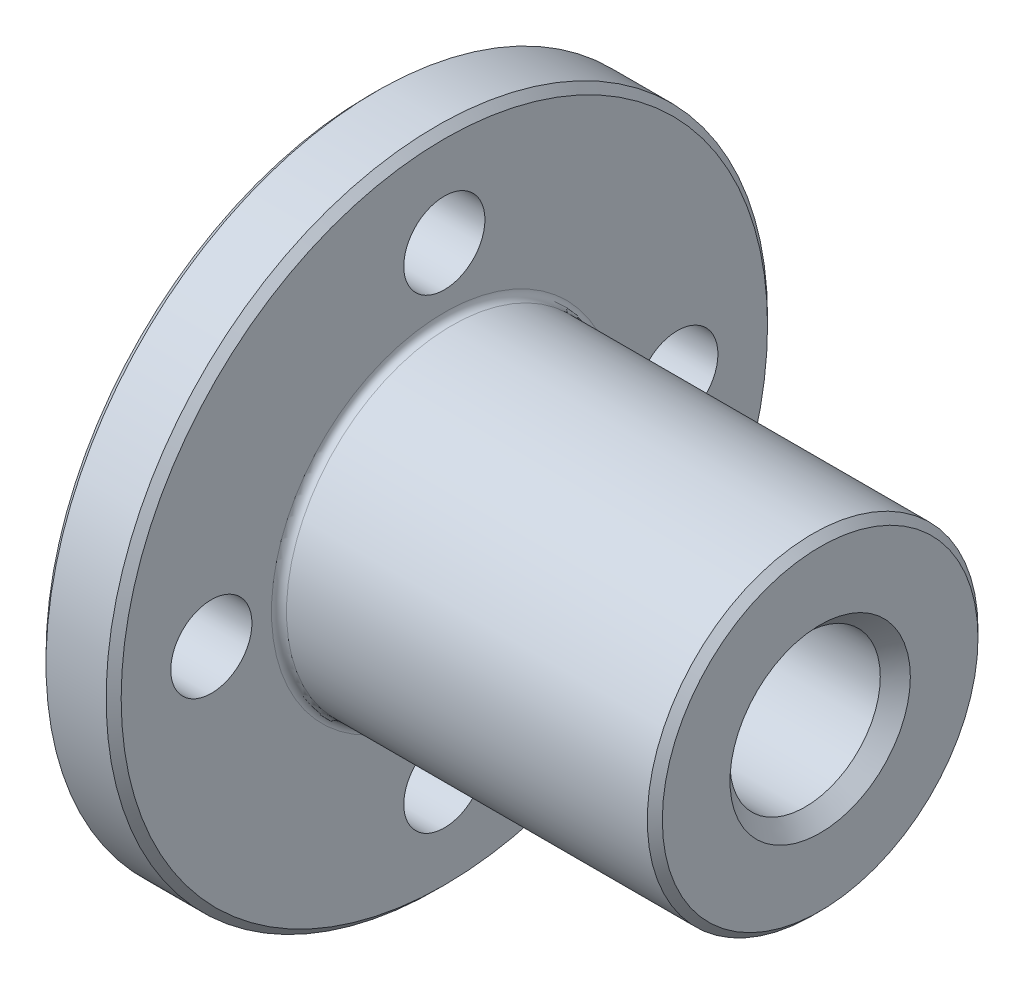
ISO-10303-21;
HEADER;
FILE_DESCRIPTION(('STEP AP214'),'2;1');
FILE_NAME('part.step','',(''),(''),'','','');
FILE_SCHEMA(('AUTOMOTIVE_DESIGN { 1 0 10303 214 1 1 1 1 }'));
ENDSEC;
DATA;
#1=APPLICATION_CONTEXT('core data for automotive mechanical design processes');
#2=APPLICATION_PROTOCOL_DEFINITION('international standard','automotive_design',2000,#1);
#3=PRODUCT_CONTEXT('',#1,'mechanical');
#4=PRODUCT('Part','Part','',(#3));
#5=PRODUCT_RELATED_PRODUCT_CATEGORY('part','',(#4));
#6=PRODUCT_DEFINITION_FORMATION('','',#4);
#7=PRODUCT_DEFINITION_CONTEXT('part definition',#1,'design');
#8=PRODUCT_DEFINITION('design','',#6,#7);
#9=PRODUCT_DEFINITION_SHAPE('','',#8);
#10=(LENGTH_UNIT() NAMED_UNIT(*) SI_UNIT(.MILLI.,.METRE.));
#11=(NAMED_UNIT(*) PLANE_ANGLE_UNIT() SI_UNIT($,.RADIAN.));
#12=(NAMED_UNIT(*) SI_UNIT($,.STERADIAN.) SOLID_ANGLE_UNIT());
#13=UNCERTAINTY_MEASURE_WITH_UNIT(LENGTH_MEASURE(1.E-05),#10,'distance_accuracy_value','');
#14=(GEOMETRIC_REPRESENTATION_CONTEXT(3) GLOBAL_UNCERTAINTY_ASSIGNED_CONTEXT((#13)) GLOBAL_UNIT_ASSIGNED_CONTEXT((#10,
#11,#12)) REPRESENTATION_CONTEXT('',''));
#15=CARTESIAN_POINT('',(0.,0.,0.));
#16=DIRECTION('',(0.,0.,1.));
#17=DIRECTION('',(1.,0.,0.));
#18=AXIS2_PLACEMENT_3D('',#15,#16,#17);
#19=CARTESIAN_POINT('',(0.,0.,0.));
#20=DIRECTION('',(1.,0.,0.));
#21=DIRECTION('',(0.,1.,0.));
#22=AXIS2_PLACEMENT_3D('',#19,#20,#21);
#23=PLANE('',#22);
#24=CARTESIAN_POINT('',(0.,0.,0.));
#25=DIRECTION('',(1.,0.,0.));
#26=DIRECTION('',(0.,0.,-1.));
#27=AXIS2_PLACEMENT_3D('',#24,#25,#26);
#28=CIRCLE('',#27,21.50000000001);
#29=CARTESIAN_POINT('',(0.,0.,-21.50000000001));
#30=VERTEX_POINT('',#29);
#31=EDGE_CURVE('E72',#30,#30,#28,.T.);
#32=ORIENTED_EDGE('',*,*,#31,.F.);
#33=EDGE_LOOP('',(#32));
#34=FACE_BOUND('',#33,.T.);
#35=CARTESIAN_POINT('',(0.,15.50000000001,0.));
#36=DIRECTION('',(1.,0.,0.));
#37=DIRECTION('',(0.,0.,-1.));
#38=AXIS2_PLACEMENT_3D('',#35,#36,#37);
#39=CIRCLE('',#38,2.70000000001);
#40=CARTESIAN_POINT('',(0.,15.50000000001,-2.70000000001));
#41=VERTEX_POINT('',#40);
#42=EDGE_CURVE('E10',#41,#41,#39,.T.);
#43=ORIENTED_EDGE('',*,*,#42,.T.);
#44=EDGE_LOOP('',(#43));
#45=FACE_BOUND('',#44,.T.);
#46=CARTESIAN_POINT('',(0.,-15.50000000001,0.));
#47=DIRECTION('',(1.,0.,0.));
#48=DIRECTION('',(0.,0.,-1.));
#49=AXIS2_PLACEMENT_3D('',#46,#47,#48);
#50=CIRCLE('',#49,2.70000000001);
#51=CARTESIAN_POINT('',(0.,-15.50000000001,-2.70000000001));
#52=VERTEX_POINT('',#51);
#53=EDGE_CURVE('E19',#52,#52,#50,.T.);
#54=ORIENTED_EDGE('',*,*,#53,.T.);
#55=EDGE_LOOP('',(#54));
#56=FACE_BOUND('',#55,.T.);
#57=CARTESIAN_POINT('',(0.,0.,0.));
#58=DIRECTION('',(1.,0.,0.));
#59=DIRECTION('',(0.,0.,-1.));
#60=AXIS2_PLACEMENT_3D('',#57,#58,#59);
#61=CIRCLE('',#60,6.00000000001);
#62=CARTESIAN_POINT('',(0.,0.,-6.00000000001));
#63=VERTEX_POINT('',#62);
#64=EDGE_CURVE('E33',#63,#63,#61,.T.);
#65=ORIENTED_EDGE('',*,*,#64,.T.);
#66=EDGE_LOOP('',(#65));
#67=FACE_BOUND('',#66,.T.);
#68=CARTESIAN_POINT('',(0.,0.,15.50000000001));
#69=DIRECTION('',(1.,0.,0.));
#70=DIRECTION('',(0.,0.,-1.));
#71=AXIS2_PLACEMENT_3D('',#68,#69,#70);
#72=CIRCLE('',#71,2.70000000001);
#73=CARTESIAN_POINT('',(0.,0.,12.8));
#74=VERTEX_POINT('',#73);
#75=EDGE_CURVE('E40',#74,#74,#72,.T.);
#76=ORIENTED_EDGE('',*,*,#75,.T.);
#77=EDGE_LOOP('',(#76));
#78=FACE_BOUND('',#77,.T.);
#79=CARTESIAN_POINT('',(0.,0.,-15.50000000001));
#80=DIRECTION('',(1.,0.,0.));
#81=DIRECTION('',(0.,0.,-1.));
#82=AXIS2_PLACEMENT_3D('',#79,#80,#81);
#83=CIRCLE('',#82,2.70000000001);
#84=CARTESIAN_POINT('',(0.,0.,-18.20000000002));
#85=VERTEX_POINT('',#84);
#86=EDGE_CURVE('E44',#85,#85,#83,.T.);
#87=ORIENTED_EDGE('',*,*,#86,.T.);
#88=EDGE_LOOP('',(#87));
#89=FACE_BOUND('',#88,.T.);
#90=ADVANCED_FACE('F15',(#34,#45,#56,#67,#78,#89),#23,.F.);
#91=CARTESIAN_POINT('',(5.,0.,-15.5));
#92=DIRECTION('',(-1.,0.,0.));
#93=DIRECTION('',(0.,0.,-1.));
#94=AXIS2_PLACEMENT_3D('',#91,#92,#93);
#95=CYLINDRICAL_SURFACE('',#94,2.7);
#96=ORIENTED_EDGE('',*,*,#86,.F.);
#97=EDGE_LOOP('',(#96));
#98=FACE_BOUND('',#97,.T.);
#99=CARTESIAN_POINT('',(5.00000000001,0.,-15.50000000001));
#100=DIRECTION('',(1.,0.,0.));
#101=DIRECTION('',(0.,0.,-1.));
#102=AXIS2_PLACEMENT_3D('',#99,#100,#101);
#103=CIRCLE('',#102,2.70000000001);
#104=CARTESIAN_POINT('',(5.00000000001,0.,-18.20000000002));
#105=VERTEX_POINT('',#104);
#106=EDGE_CURVE('E45',#105,#105,#103,.T.);
#107=ORIENTED_EDGE('',*,*,#106,.T.);
#108=EDGE_LOOP('',(#107));
#109=FACE_BOUND('',#108,.T.);
#110=ADVANCED_FACE('F127',(#98,#109),#95,.F.);
#111=CARTESIAN_POINT('',(5.,21.5,0.));
#112=DIRECTION('',(-1.,0.,0.));
#113=DIRECTION('',(0.,0.,1.));
#114=AXIS2_PLACEMENT_3D('',#111,#112,#113);
#115=PLANE('',#114);
#116=CARTESIAN_POINT('',(5.00000000001,0.,0.));
#117=DIRECTION('',(1.,0.,0.));
#118=DIRECTION('',(0.,0.,-1.));
#119=AXIS2_PLACEMENT_3D('',#116,#117,#118);
#120=CIRCLE('',#119,21.50000000001);
#121=CARTESIAN_POINT('',(5.00000000001,0.,-21.50000000001));
#122=VERTEX_POINT('',#121);
#123=EDGE_CURVE('E49',#122,#122,#120,.T.);
#124=ORIENTED_EDGE('',*,*,#123,.T.);
#125=EDGE_LOOP('',(#124));
#126=FACE_BOUND('',#125,.T.);
#127=CARTESIAN_POINT('',(5.00000000001,0.,0.));
#128=DIRECTION('',(1.,0.,0.));
#129=DIRECTION('',(0.,0.,-1.));
#130=AXIS2_PLACEMENT_3D('',#127,#128,#129);
#131=CIRCLE('',#130,11.50000000001);
#132=CARTESIAN_POINT('',(5.00000000001,0.,-11.50000000001));
#133=VERTEX_POINT('',#132);
#134=EDGE_CURVE('E54',#133,#133,#131,.T.);
#135=ORIENTED_EDGE('',*,*,#134,.F.);
#136=EDGE_LOOP('',(#135));
#137=FACE_BOUND('',#136,.T.);
#138=CARTESIAN_POINT('',(5.00000000001,15.50000000001,0.));
#139=DIRECTION('',(1.,0.,0.));
#140=DIRECTION('',(0.,0.,1.));
#141=AXIS2_PLACEMENT_3D('',#138,#139,#140);
#142=CIRCLE('',#141,2.70000000001);
#143=CARTESIAN_POINT('',(5.00000000001,15.50000000001,2.70000000001));
#144=VERTEX_POINT('',#143);
#145=EDGE_CURVE('E60',#144,#144,#142,.T.);
#146=ORIENTED_EDGE('',*,*,#145,.F.);
#147=EDGE_LOOP('',(#146));
#148=FACE_BOUND('',#147,.T.);
#149=CARTESIAN_POINT('',(5.00000000001,-15.50000000001,0.));
#150=DIRECTION('',(1.,0.,0.));
#151=DIRECTION('',(0.,0.,-1.));
#152=AXIS2_PLACEMENT_3D('',#149,#150,#151);
#153=CIRCLE('',#152,2.70000000001);
#154=CARTESIAN_POINT('',(5.00000000001,-15.50000000001,-2.70000000001));
#155=VERTEX_POINT('',#154);
#156=EDGE_CURVE('E61',#155,#155,#153,.T.);
#157=ORIENTED_EDGE('',*,*,#156,.F.);
#158=EDGE_LOOP('',(#157));
#159=FACE_BOUND('',#158,.T.);
#160=CARTESIAN_POINT('',(5.00000000001,0.,15.50000000001));
#161=DIRECTION('',(1.,0.,0.));
#162=DIRECTION('',(0.,0.,-1.));
#163=AXIS2_PLACEMENT_3D('',#160,#161,#162);
#164=CIRCLE('',#163,2.70000000001);
#165=CARTESIAN_POINT('',(5.00000000001,0.,12.8));
#166=VERTEX_POINT('',#165);
#167=EDGE_CURVE('E65',#166,#166,#164,.T.);
#168=ORIENTED_EDGE('',*,*,#167,.F.);
#169=EDGE_LOOP('',(#168));
#170=FACE_BOUND('',#169,.T.);
#171=ORIENTED_EDGE('',*,*,#106,.F.);
#172=EDGE_LOOP('',(#171));
#173=FACE_BOUND('',#172,.T.);
#174=ADVANCED_FACE('F106',(#126,#137,#148,#159,#170,#173),#115,.F.);
#175=CARTESIAN_POINT('',(30.,10.5,0.));
#176=DIRECTION('',(-1.,0.,0.));
#177=DIRECTION('',(0.,0.,1.));
#178=AXIS2_PLACEMENT_3D('',#175,#176,#177);
#179=PLANE('',#178);
#180=CARTESIAN_POINT('',(30.00000000001,0.,0.));
#181=DIRECTION('',(1.,0.,0.));
#182=DIRECTION('',(0.,0.,-1.));
#183=AXIS2_PLACEMENT_3D('',#180,#181,#182);
#184=CIRCLE('',#183,10.50000000001);
#185=CARTESIAN_POINT('',(30.00000000001,0.,-10.50000000001));
#186=VERTEX_POINT('',#185);
#187=EDGE_CURVE('E75',#186,#186,#184,.T.);
#188=ORIENTED_EDGE('',*,*,#187,.T.);
#189=EDGE_LOOP('',(#188));
#190=FACE_BOUND('',#189,.T.);
#191=CARTESIAN_POINT('',(30.00000000001,0.,0.));
#192=DIRECTION('',(1.,0.,0.));
#193=DIRECTION('',(0.,0.,-1.));
#194=AXIS2_PLACEMENT_3D('',#191,#192,#193);
#195=CIRCLE('',#194,6.00000000001);
#196=CARTESIAN_POINT('',(30.00000000001,0.,-6.00000000001));
#197=VERTEX_POINT('',#196);
#198=EDGE_CURVE('E56',#197,#197,#195,.T.);
#199=ORIENTED_EDGE('',*,*,#198,.F.);
#200=EDGE_LOOP('',(#199));
#201=FACE_BOUND('',#200,.T.);
#202=ADVANCED_FACE('F144',(#190,#201),#179,.F.);
#203=CARTESIAN_POINT('',(0.,0.,0.));
#204=DIRECTION('',(1.,0.,0.));
#205=DIRECTION('',(0.,0.,-1.));
#206=AXIS2_PLACEMENT_3D('',#203,#204,#205);
#207=CONICAL_SURFACE('',#206,21.5,0.785398163397445);
#208=CARTESIAN_POINT('',(0.50000000001,0.,0.));
#209=DIRECTION('',(1.,0.,0.));
#210=DIRECTION('',(0.,0.,-1.));
#211=AXIS2_PLACEMENT_3D('',#208,#209,#210);
#212=CIRCLE('',#211,22.00000000001);
#213=CARTESIAN_POINT('',(0.50000000001,0.,-22.00000000001));
#214=VERTEX_POINT('',#213);
#215=EDGE_CURVE('E55',#214,#214,#212,.T.);
#216=ORIENTED_EDGE('',*,*,#215,.F.);
#217=EDGE_LOOP('',(#216));
#218=FACE_BOUND('',#217,.T.);
#219=ORIENTED_EDGE('',*,*,#31,.T.);
#220=EDGE_LOOP('',(#219));
#221=FACE_BOUND('',#220,.T.);
#222=ADVANCED_FACE('F122',(#218,#221),#207,.T.);
#223=CARTESIAN_POINT('',(5.5,0.,0.));
#224=DIRECTION('',(1.,0.,0.));
#225=DIRECTION('',(0.,0.,-1.));
#226=AXIS2_PLACEMENT_3D('',#223,#224,#225);
#227=TOROIDAL_SURFACE('',#226,11.5,0.5);
#228=ORIENTED_EDGE('',*,*,#134,.T.);
#229=EDGE_LOOP('',(#228));
#230=FACE_BOUND('',#229,.T.);
#231=CARTESIAN_POINT('',(5.50000000001001,0.,0.));
#232=DIRECTION('',(1.,0.,0.));
#233=DIRECTION('',(0.,0.,-1.));
#234=AXIS2_PLACEMENT_3D('',#231,#232,#233);
#235=CIRCLE('',#234,11.00000000001);
#236=CARTESIAN_POINT('',(5.50000000001001,0.,-11.00000000001));
#237=VERTEX_POINT('',#236);
#238=EDGE_CURVE('E84',#237,#237,#235,.T.);
#239=ORIENTED_EDGE('',*,*,#238,.F.);
#240=EDGE_LOOP('',(#239));
#241=FACE_BOUND('',#240,.T.);
#242=ADVANCED_FACE('F17',(#230,#241),#227,.F.);
#243=CARTESIAN_POINT('',(4.5,0.,0.));
#244=DIRECTION('',(-1.,0.,0.));
#245=DIRECTION('',(0.,0.,1.));
#246=AXIS2_PLACEMENT_3D('',#243,#244,#245);
#247=CONICAL_SURFACE('',#246,22.,0.785398163397445);
#248=CARTESIAN_POINT('',(4.50000000001,0.,0.));
#249=DIRECTION('',(1.,0.,0.));
#250=DIRECTION('',(0.,0.,-1.));
#251=AXIS2_PLACEMENT_3D('',#248,#249,#250);
#252=CIRCLE('',#251,22.00000000001);
#253=CARTESIAN_POINT('',(4.50000000001,0.,-22.00000000001));
#254=VERTEX_POINT('',#253);
#255=EDGE_CURVE('E50',#254,#254,#252,.T.);
#256=ORIENTED_EDGE('',*,*,#255,.T.);
#257=EDGE_LOOP('',(#256));
#258=FACE_BOUND('',#257,.T.);
#259=ORIENTED_EDGE('',*,*,#123,.F.);
#260=EDGE_LOOP('',(#259));
#261=FACE_BOUND('',#260,.T.);
#262=ADVANCED_FACE('F109',(#258,#261),#247,.T.);
#263=CARTESIAN_POINT('',(30.,0.,0.));
#264=DIRECTION('',(-1.,0.,0.));
#265=DIRECTION('',(0.,0.,-1.));
#266=AXIS2_PLACEMENT_3D('',#263,#264,#265);
#267=CYLINDRICAL_SURFACE('',#266,22.);
#268=ORIENTED_EDGE('',*,*,#215,.T.);
#269=EDGE_LOOP('',(#268));
#270=FACE_BOUND('',#269,.T.);
#271=ORIENTED_EDGE('',*,*,#255,.F.);
#272=EDGE_LOOP('',(#271));
#273=FACE_BOUND('',#272,.T.);
#274=ADVANCED_FACE('F111',(#270,#273),#267,.T.);
#275=CARTESIAN_POINT('',(30.,0.,0.));
#276=DIRECTION('',(-1.,0.,0.));
#277=DIRECTION('',(0.,0.,-1.));
#278=AXIS2_PLACEMENT_3D('',#275,#276,#277);
#279=CYLINDRICAL_SURFACE('',#278,11.);
#280=ORIENTED_EDGE('',*,*,#238,.T.);
#281=EDGE_LOOP('',(#280));
#282=FACE_BOUND('',#281,.T.);
#283=CARTESIAN_POINT('',(29.50000000001,0.,0.));
#284=DIRECTION('',(1.,0.,0.));
#285=DIRECTION('',(0.,0.,-1.));
#286=AXIS2_PLACEMENT_3D('',#283,#284,#285);
#287=CIRCLE('',#286,11.00000000001);
#288=CARTESIAN_POINT('',(29.50000000001,0.,-11.00000000001));
#289=VERTEX_POINT('',#288);
#290=EDGE_CURVE('E80',#289,#289,#287,.T.);
#291=ORIENTED_EDGE('',*,*,#290,.F.);
#292=EDGE_LOOP('',(#291));
#293=FACE_BOUND('',#292,.T.);
#294=ADVANCED_FACE('F119',(#282,#293),#279,.T.);
#295=CARTESIAN_POINT('',(29.5,0.,0.));
#296=DIRECTION('',(-1.,0.,0.));
#297=DIRECTION('',(0.,0.,1.));
#298=AXIS2_PLACEMENT_3D('',#295,#296,#297);
#299=CONICAL_SURFACE('',#298,11.,0.785398163397447);
#300=ORIENTED_EDGE('',*,*,#290,.T.);
#301=EDGE_LOOP('',(#300));
#302=FACE_BOUND('',#301,.T.);
#303=ORIENTED_EDGE('',*,*,#187,.F.);
#304=EDGE_LOOP('',(#303));
#305=FACE_BOUND('',#304,.T.);
#306=ADVANCED_FACE('F244',(#302,#305),#299,.T.);
#307=CARTESIAN_POINT('',(0.,0.,0.));
#308=DIRECTION('',(-1.,0.,0.));
#309=DIRECTION('',(0.,0.,1.));
#310=AXIS2_PLACEMENT_3D('',#307,#308,#309);
#311=CONICAL_SURFACE('',#310,6.,0.785398163397448);
#312=ORIENTED_EDGE('',*,*,#64,.F.);
#313=EDGE_LOOP('',(#312));
#314=FACE_BOUND('',#313,.T.);
#315=CARTESIAN_POINT('',(1.00000000001,0.,0.));
#316=DIRECTION('',(1.,0.,0.));
#317=DIRECTION('',(0.,0.,-1.));
#318=AXIS2_PLACEMENT_3D('',#315,#316,#317);
#319=CIRCLE('',#318,5.00000000001);
#320=CARTESIAN_POINT('',(1.00000000001,0.,-5.00000000001));
#321=VERTEX_POINT('',#320);
#322=EDGE_CURVE('E76',#321,#321,#319,.T.);
#323=ORIENTED_EDGE('',*,*,#322,.T.);
#324=EDGE_LOOP('',(#323));
#325=FACE_BOUND('',#324,.T.);
#326=ADVANCED_FACE('F235',(#314,#325),#311,.F.);
#327=CARTESIAN_POINT('',(30.,0.,0.));
#328=DIRECTION('',(-1.,0.,0.));
#329=DIRECTION('',(0.,0.,-1.));
#330=AXIS2_PLACEMENT_3D('',#327,#328,#329);
#331=CYLINDRICAL_SURFACE('',#330,5.);
#332=ORIENTED_EDGE('',*,*,#322,.F.);
#333=EDGE_LOOP('',(#332));
#334=FACE_BOUND('',#333,.T.);
#335=CARTESIAN_POINT('',(29.00000000001,0.,0.));
#336=DIRECTION('',(1.,0.,0.));
#337=DIRECTION('',(0.,0.,-1.));
#338=AXIS2_PLACEMENT_3D('',#335,#336,#337);
#339=CIRCLE('',#338,5.00000000001);
#340=CARTESIAN_POINT('',(29.00000000001,0.,-5.00000000001));
#341=VERTEX_POINT('',#340);
#342=EDGE_CURVE('E36',#341,#341,#339,.T.);
#343=ORIENTED_EDGE('',*,*,#342,.T.);
#344=EDGE_LOOP('',(#343));
#345=FACE_BOUND('',#344,.T.);
#346=ADVANCED_FACE('F138',(#334,#345),#331,.F.);
#347=CARTESIAN_POINT('',(29.,0.,0.));
#348=DIRECTION('',(1.,0.,0.));
#349=DIRECTION('',(0.,0.,-1.));
#350=AXIS2_PLACEMENT_3D('',#347,#348,#349);
#351=CONICAL_SURFACE('',#350,5.,0.78539816339745);
#352=ORIENTED_EDGE('',*,*,#198,.T.);
#353=EDGE_LOOP('',(#352));
#354=FACE_BOUND('',#353,.T.);
#355=ORIENTED_EDGE('',*,*,#342,.F.);
#356=EDGE_LOOP('',(#355));
#357=FACE_BOUND('',#356,.T.);
#358=ADVANCED_FACE('F142',(#354,#357),#351,.F.);
#359=CARTESIAN_POINT('',(5.,15.5,0.));
#360=DIRECTION('',(-1.,0.,0.));
#361=DIRECTION('',(0.,0.,-1.));
#362=AXIS2_PLACEMENT_3D('',#359,#360,#361);
#363=CYLINDRICAL_SURFACE('',#362,2.7);
#364=ORIENTED_EDGE('',*,*,#42,.F.);
#365=EDGE_LOOP('',(#364));
#366=FACE_BOUND('',#365,.T.);
#367=ORIENTED_EDGE('',*,*,#145,.T.);
#368=EDGE_LOOP('',(#367));
#369=FACE_BOUND('',#368,.T.);
#370=ADVANCED_FACE('F139',(#366,#369),#363,.F.);
#371=CARTESIAN_POINT('',(5.,0.,15.5));
#372=DIRECTION('',(-1.,0.,0.));
#373=DIRECTION('',(0.,0.,-1.));
#374=AXIS2_PLACEMENT_3D('',#371,#372,#373);
#375=CYLINDRICAL_SURFACE('',#374,2.7);
#376=ORIENTED_EDGE('',*,*,#75,.F.);
#377=EDGE_LOOP('',(#376));
#378=FACE_BOUND('',#377,.T.);
#379=ORIENTED_EDGE('',*,*,#167,.T.);
#380=EDGE_LOOP('',(#379));
#381=FACE_BOUND('',#380,.T.);
#382=ADVANCED_FACE('F141',(#378,#381),#375,.F.);
#383=CARTESIAN_POINT('',(5.,-15.5,0.));
#384=DIRECTION('',(-1.,0.,0.));
#385=DIRECTION('',(0.,0.,-1.));
#386=AXIS2_PLACEMENT_3D('',#383,#384,#385);
#387=CYLINDRICAL_SURFACE('',#386,2.7);
#388=ORIENTED_EDGE('',*,*,#53,.F.);
#389=EDGE_LOOP('',(#388));
#390=FACE_BOUND('',#389,.T.);
#391=ORIENTED_EDGE('',*,*,#156,.T.);
#392=EDGE_LOOP('',(#391));
#393=FACE_BOUND('',#392,.T.);
#394=ADVANCED_FACE('F200',(#390,#393),#387,.F.);
#395=CLOSED_SHELL('',(#90,#110,#174,#202,#222,#242,#262,#274,#294,#306,#326,#346,#358,#370,#382,#394));
#396=MANIFOLD_SOLID_BREP('B1',#395);
#397=ADVANCED_BREP_SHAPE_REPRESENTATION('',(#18,#396),#14);
#398=SHAPE_DEFINITION_REPRESENTATION(#9,#397);
ENDSEC;
END-ISO-10303-21;
